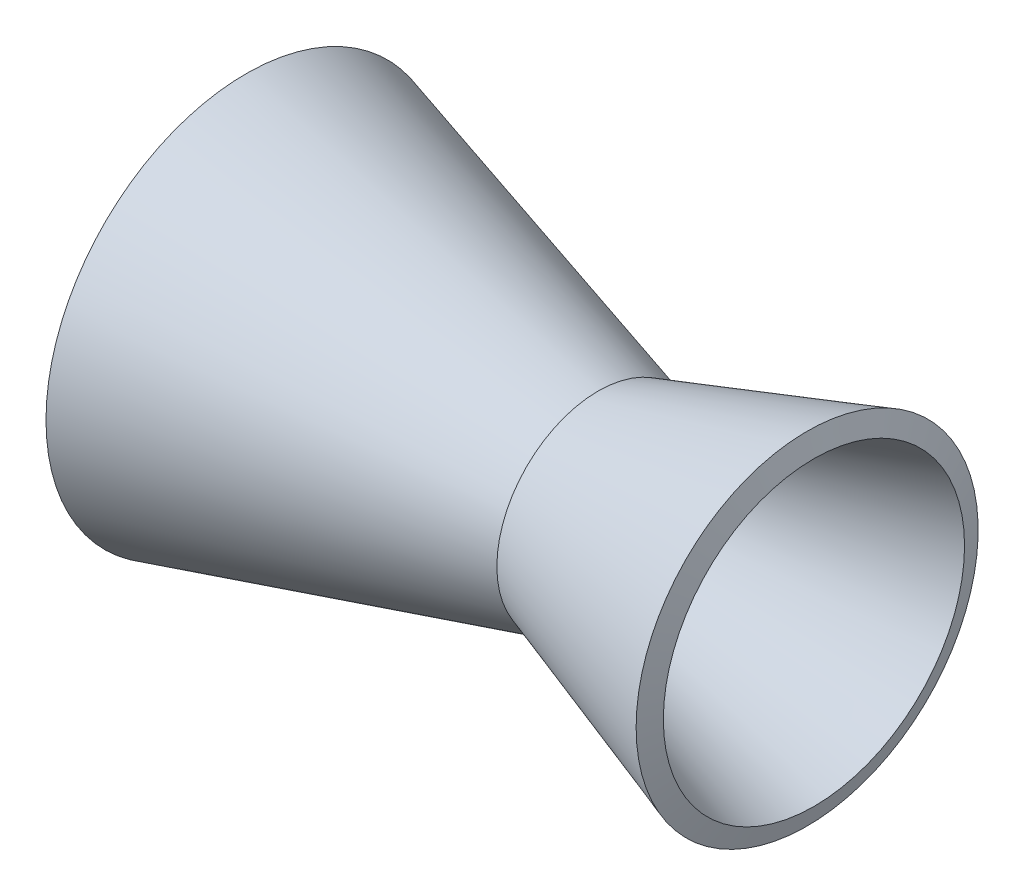
ISO-10303-21;
HEADER;
FILE_DESCRIPTION(('STEP AP214'),'2;1');
FILE_NAME('part.step','',(''),(''),'','','');
FILE_SCHEMA(('AUTOMOTIVE_DESIGN { 1 0 10303 214 1 1 1 1 }'));
ENDSEC;
DATA;
#1=APPLICATION_CONTEXT('core data for automotive mechanical design processes');
#2=APPLICATION_PROTOCOL_DEFINITION('international standard','automotive_design',2000,#1);
#3=PRODUCT_CONTEXT('',#1,'mechanical');
#4=PRODUCT('Part','Part','',(#3));
#5=PRODUCT_RELATED_PRODUCT_CATEGORY('part','',(#4));
#6=PRODUCT_DEFINITION_FORMATION('','',#4);
#7=PRODUCT_DEFINITION_CONTEXT('part definition',#1,'design');
#8=PRODUCT_DEFINITION('design','',#6,#7);
#9=PRODUCT_DEFINITION_SHAPE('','',#8);
#10=(LENGTH_UNIT() NAMED_UNIT(*) SI_UNIT(.MILLI.,.METRE.));
#11=(NAMED_UNIT(*) PLANE_ANGLE_UNIT() SI_UNIT($,.RADIAN.));
#12=(NAMED_UNIT(*) SI_UNIT($,.STERADIAN.) SOLID_ANGLE_UNIT());
#13=UNCERTAINTY_MEASURE_WITH_UNIT(LENGTH_MEASURE(1.E-05),#10,'distance_accuracy_value','');
#14=(GEOMETRIC_REPRESENTATION_CONTEXT(3) GLOBAL_UNCERTAINTY_ASSIGNED_CONTEXT((#13)) GLOBAL_UNIT_ASSIGNED_CONTEXT((#10,
#11,#12)) REPRESENTATION_CONTEXT('',''));
#15=CARTESIAN_POINT('',(0.,0.,0.));
#16=DIRECTION('',(0.,0.,1.));
#17=DIRECTION('',(1.,0.,0.));
#18=AXIS2_PLACEMENT_3D('',#15,#16,#17);
#19=CARTESIAN_POINT('',(70.,0.,0.));
#20=DIRECTION('',(1.,0.,0.));
#21=DIRECTION('',(0.,0.,-1.));
#22=AXIS2_PLACEMENT_3D('',#19,#20,#21);
#23=CONICAL_SURFACE('',#22,11.,0.321750554396642);
#24=CARTESIAN_POINT('',(100.,0.,0.));
#25=DIRECTION('',(-1.,0.,0.));
#26=DIRECTION('',(0.,0.,1.));
#27=AXIS2_PLACEMENT_3D('',#24,#25,#26);
#28=CIRCLE('',#27,21.);
#29=CARTESIAN_POINT('',(100.,0.,21.));
#30=VERTEX_POINT('',#29);
#31=EDGE_CURVE('E69',#30,#30,#28,.T.);
#32=ORIENTED_EDGE('',*,*,#31,.F.);
#33=EDGE_LOOP('',(#32));
#34=FACE_BOUND('',#33,.T.);
#35=CARTESIAN_POINT('',(70.,0.,0.));
#36=DIRECTION('',(-1.,0.,0.));
#37=DIRECTION('',(0.,0.,1.));
#38=AXIS2_PLACEMENT_3D('',#35,#36,#37);
#39=CIRCLE('',#38,11.);
#40=CARTESIAN_POINT('',(70.,0.,11.));
#41=VERTEX_POINT('',#40);
#42=EDGE_CURVE('E10',#41,#41,#39,.T.);
#43=ORIENTED_EDGE('',*,*,#42,.T.);
#44=EDGE_LOOP('',(#43));
#45=FACE_BOUND('',#44,.T.);
#46=ADVANCED_FACE('F43',(#34,#45),#23,.F.);
#47=CARTESIAN_POINT('',(20.,0.,0.));
#48=DIRECTION('',(-1.,0.,0.));
#49=DIRECTION('',(0.,0.,1.));
#50=AXIS2_PLACEMENT_3D('',#47,#48,#49);
#51=CONICAL_SURFACE('',#50,25.,0.273008703086711);
#52=ORIENTED_EDGE('',*,*,#42,.F.);
#53=EDGE_LOOP('',(#52));
#54=FACE_BOUND('',#53,.T.);
#55=CARTESIAN_POINT('',(20.,0.,0.));
#56=DIRECTION('',(-1.,0.,0.));
#57=DIRECTION('',(0.,0.,1.));
#58=AXIS2_PLACEMENT_3D('',#55,#56,#57);
#59=CIRCLE('',#58,25.);
#60=CARTESIAN_POINT('',(20.,0.,25.));
#61=VERTEX_POINT('',#60);
#62=EDGE_CURVE('E49',#61,#61,#59,.T.);
#63=ORIENTED_EDGE('',*,*,#62,.T.);
#64=EDGE_LOOP('',(#63));
#65=FACE_BOUND('',#64,.T.);
#66=ADVANCED_FACE('F78',(#54,#65),#51,.F.);
#67=CARTESIAN_POINT('',(20.,0.,0.));
#68=DIRECTION('',(1.,0.,0.));
#69=DIRECTION('',(0.,0.,-1.));
#70=AXIS2_PLACEMENT_3D('',#67,#68,#69);
#71=CONICAL_SURFACE('',#70,25.,1.29778762370819);
#72=CARTESIAN_POINT('',(20.8088897765599,0.,0.));
#73=DIRECTION('',(-1.,0.,0.));
#74=DIRECTION('',(0.,0.,1.));
#75=AXIS2_PLACEMENT_3D('',#72,#73,#74);
#76=CIRCLE('',#75,27.8888920591425);
#77=CARTESIAN_POINT('',(20.8088897765599,0.,27.8888920591425));
#78=VERTEX_POINT('',#77);
#79=EDGE_CURVE('E54',#78,#78,#76,.T.);
#80=ORIENTED_EDGE('',*,*,#79,.T.);
#81=EDGE_LOOP('',(#80));
#82=FACE_BOUND('',#81,.T.);
#83=ORIENTED_EDGE('',*,*,#62,.F.);
#84=EDGE_LOOP('',(#83));
#85=FACE_BOUND('',#84,.T.);
#86=ADVANCED_FACE('F82',(#82,#85),#71,.T.);
#87=CARTESIAN_POINT('',(20.8088897765599,0.,0.));
#88=DIRECTION('',(-1.,0.,0.));
#89=DIRECTION('',(0.,0.,1.));
#90=AXIS2_PLACEMENT_3D('',#87,#88,#89);
#91=CONICAL_SURFACE('',#90,27.8888920591425,0.273008703086711);
#92=CARTESIAN_POINT('',(69.9235383745831,0.,0.));
#93=DIRECTION('',(-1.,0.,0.));
#94=DIRECTION('',(0.,0.,1.));
#95=AXIS2_PLACEMENT_3D('',#92,#93,#94);
#96=CIRCLE('',#95,14.1367904516961);
#97=CARTESIAN_POINT('',(69.9235383745831,0.,14.1367904516961));
#98=VERTEX_POINT('',#97);
#99=EDGE_CURVE('E58',#98,#98,#96,.T.);
#100=ORIENTED_EDGE('',*,*,#99,.T.);
#101=EDGE_LOOP('',(#100));
#102=FACE_BOUND('',#101,.T.);
#103=ORIENTED_EDGE('',*,*,#79,.F.);
#104=EDGE_LOOP('',(#103));
#105=FACE_BOUND('',#104,.T.);
#106=ADVANCED_FACE('F86',(#102,#105),#91,.T.);
#107=CARTESIAN_POINT('',(69.9235383745831,0.,0.));
#108=DIRECTION('',(1.,0.,0.));
#109=DIRECTION('',(0.,0.,-1.));
#110=AXIS2_PLACEMENT_3D('',#107,#108,#109);
#111=CONICAL_SURFACE('',#110,14.1367904516961,0.321750554396642);
#112=CARTESIAN_POINT('',(99.0513167019495,0.,0.));
#113=DIRECTION('',(-1.,0.,0.));
#114=DIRECTION('',(0.,0.,1.));
#115=AXIS2_PLACEMENT_3D('',#112,#113,#114);
#116=CIRCLE('',#115,23.8460498941515);
#117=CARTESIAN_POINT('',(99.0513167019495,0.,23.8460498941515));
#118=VERTEX_POINT('',#117);
#119=EDGE_CURVE('E66',#118,#118,#116,.T.);
#120=ORIENTED_EDGE('',*,*,#119,.T.);
#121=EDGE_LOOP('',(#120));
#122=FACE_BOUND('',#121,.T.);
#123=ORIENTED_EDGE('',*,*,#99,.F.);
#124=EDGE_LOOP('',(#123));
#125=FACE_BOUND('',#124,.T.);
#126=ADVANCED_FACE('F94',(#122,#125),#111,.T.);
#127=CARTESIAN_POINT('',(99.0513167019495,0.,0.));
#128=DIRECTION('',(-1.,0.,0.));
#129=DIRECTION('',(0.,0.,1.));
#130=AXIS2_PLACEMENT_3D('',#127,#128,#129);
#131=CONICAL_SURFACE('',#130,23.8460498941515,1.24904577239826);
#132=ORIENTED_EDGE('',*,*,#31,.T.);
#133=EDGE_LOOP('',(#132));
#134=FACE_BOUND('',#133,.T.);
#135=ORIENTED_EDGE('',*,*,#119,.F.);
#136=EDGE_LOOP('',(#135));
#137=FACE_BOUND('',#136,.T.);
#138=ADVANCED_FACE('F73',(#134,#137),#131,.T.);
#139=CLOSED_SHELL('',(#46,#66,#86,#106,#126,#138));
#140=MANIFOLD_SOLID_BREP('B2',#139);
#141=ADVANCED_BREP_SHAPE_REPRESENTATION('',(#18,#140),#14);
#142=SHAPE_DEFINITION_REPRESENTATION(#9,#141);
ENDSEC;
END-ISO-10303-21;
